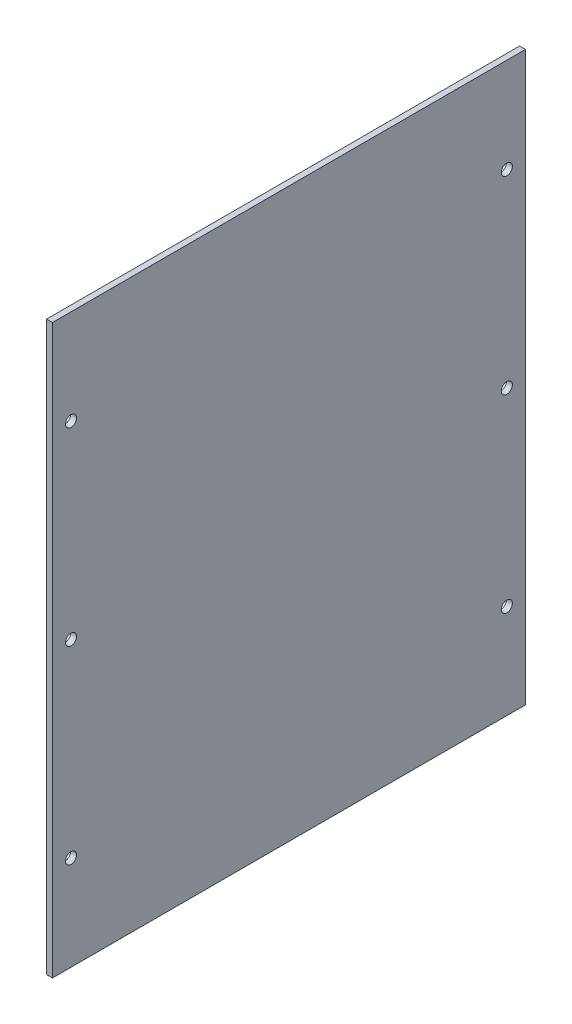
ISO-10303-21;
HEADER;
FILE_DESCRIPTION(('STEP AP214'),'2;1');
FILE_NAME('part.step','',(''),(''),'','','');
FILE_SCHEMA(('AUTOMOTIVE_DESIGN { 1 0 10303 214 1 1 1 1 }'));
ENDSEC;
DATA;
#1=APPLICATION_CONTEXT('core data for automotive mechanical design processes');
#2=APPLICATION_PROTOCOL_DEFINITION('international standard','automotive_design',2000,#1);
#3=PRODUCT_CONTEXT('',#1,'mechanical');
#4=PRODUCT('Part','Part','',(#3));
#5=PRODUCT_RELATED_PRODUCT_CATEGORY('part','',(#4));
#6=PRODUCT_DEFINITION_FORMATION('','',#4);
#7=PRODUCT_DEFINITION_CONTEXT('part definition',#1,'design');
#8=PRODUCT_DEFINITION('design','',#6,#7);
#9=PRODUCT_DEFINITION_SHAPE('','',#8);
#10=(LENGTH_UNIT() NAMED_UNIT(*) SI_UNIT(.MILLI.,.METRE.));
#11=(NAMED_UNIT(*) PLANE_ANGLE_UNIT() SI_UNIT($,.RADIAN.));
#12=(NAMED_UNIT(*) SI_UNIT($,.STERADIAN.) SOLID_ANGLE_UNIT());
#13=UNCERTAINTY_MEASURE_WITH_UNIT(LENGTH_MEASURE(1.E-05),#10,'distance_accuracy_value','');
#14=(GEOMETRIC_REPRESENTATION_CONTEXT(3) GLOBAL_UNCERTAINTY_ASSIGNED_CONTEXT((#13)) GLOBAL_UNIT_ASSIGNED_CONTEXT((#10,
#11,#12)) REPRESENTATION_CONTEXT('',''));
#15=CARTESIAN_POINT('',(0.,0.,0.));
#16=DIRECTION('',(0.,0.,1.));
#17=DIRECTION('',(1.,0.,0.));
#18=AXIS2_PLACEMENT_3D('',#15,#16,#17);
#19=CARTESIAN_POINT('',(1.5875,152.4,127.));
#20=DIRECTION('',(-1.,0.,0.));
#21=DIRECTION('',(0.,0.,1.));
#22=AXIS2_PLACEMENT_3D('',#19,#20,#21);
#23=PLANE('',#22);
#24=CARTESIAN_POINT('',(1.5875,101.6,-116.999999999999));
#25=DIRECTION('',(1.,0.,0.));
#26=DIRECTION('',(0.,0.,-1.));
#27=AXIS2_PLACEMENT_3D('',#24,#25,#26);
#28=CIRCLE('',#27,2.9718);
#29=CARTESIAN_POINT('',(1.5875,101.6,-119.971799999999));
#30=VERTEX_POINT('',#29);
#31=EDGE_CURVE('E138',#30,#30,#28,.T.);
#32=ORIENTED_EDGE('',*,*,#31,.F.);
#33=EDGE_LOOP('',(#32));
#34=FACE_BOUND('',#33,.T.);
#35=CARTESIAN_POINT('',(1.5875,-101.6,-116.999999999999));
#36=DIRECTION('',(1.,0.,0.));
#37=DIRECTION('',(0.,0.,1.));
#38=AXIS2_PLACEMENT_3D('',#35,#36,#37);
#39=CIRCLE('',#38,2.9718);
#40=CARTESIAN_POINT('',(1.5875,-101.6,-114.028199999999));
#41=VERTEX_POINT('',#40);
#42=EDGE_CURVE('E132',#41,#41,#39,.T.);
#43=ORIENTED_EDGE('',*,*,#42,.F.);
#44=EDGE_LOOP('',(#43));
#45=FACE_BOUND('',#44,.T.);
#46=CARTESIAN_POINT('',(1.5875,-8.32667268468867E-13,117.));
#47=DIRECTION('',(1.,0.,0.));
#48=DIRECTION('',(0.,0.,1.));
#49=AXIS2_PLACEMENT_3D('',#46,#47,#48);
#50=CIRCLE('',#49,2.9718);
#51=CARTESIAN_POINT('',(1.5875,-8.32667268468867E-13,119.9718));
#52=VERTEX_POINT('',#51);
#53=EDGE_CURVE('E126',#52,#52,#50,.T.);
#54=ORIENTED_EDGE('',*,*,#53,.F.);
#55=EDGE_LOOP('',(#54));
#56=FACE_BOUND('',#55,.T.);
#57=CARTESIAN_POINT('',(1.5875,-101.600000000001,116.999999999999));
#58=DIRECTION('',(1.,0.,0.));
#59=DIRECTION('',(0.,0.,-1.));
#60=AXIS2_PLACEMENT_3D('',#57,#58,#59);
#61=CIRCLE('',#60,2.9718);
#62=CARTESIAN_POINT('',(1.5875,-101.600000000001,114.028199999999));
#63=VERTEX_POINT('',#62);
#64=EDGE_CURVE('E119',#63,#63,#61,.T.);
#65=ORIENTED_EDGE('',*,*,#64,.F.);
#66=EDGE_LOOP('',(#65));
#67=FACE_BOUND('',#66,.T.);
#68=CARTESIAN_POINT('',(1.5875,101.599999999999,117.));
#69=DIRECTION('',(1.,0.,0.));
#70=DIRECTION('',(0.,0.,1.));
#71=AXIS2_PLACEMENT_3D('',#68,#69,#70);
#72=CIRCLE('',#71,2.9718);
#73=CARTESIAN_POINT('',(1.5875,101.599999999999,119.9718));
#74=VERTEX_POINT('',#73);
#75=EDGE_CURVE('E143',#74,#74,#72,.T.);
#76=ORIENTED_EDGE('',*,*,#75,.F.);
#77=EDGE_LOOP('',(#76));
#78=FACE_BOUND('',#77,.T.);
#79=CARTESIAN_POINT('',(1.5875,0.,-117.));
#80=DIRECTION('',(1.,0.,0.));
#81=DIRECTION('',(0.,0.,-1.));
#82=AXIS2_PLACEMENT_3D('',#79,#80,#81);
#83=CIRCLE('',#82,2.9718);
#84=CARTESIAN_POINT('',(1.5875,0.,-119.9718));
#85=VERTEX_POINT('',#84);
#86=EDGE_CURVE('E113',#85,#85,#83,.T.);
#87=ORIENTED_EDGE('',*,*,#86,.F.);
#88=EDGE_LOOP('',(#87));
#89=FACE_BOUND('',#88,.T.);
#90=DIRECTION('',(0.,0.,-1.));
#91=VECTOR('',#90,1.);
#92=CARTESIAN_POINT('',(1.5875,-152.4,127.));
#93=LINE('',#92,#91);
#94=CARTESIAN_POINT('',(1.5875,-152.4,127.));
#95=VERTEX_POINT('',#94);
#96=CARTESIAN_POINT('',(1.5875,-152.4,-127.));
#97=VERTEX_POINT('',#96);
#98=EDGE_CURVE('E99',#95,#97,#93,.T.);
#99=ORIENTED_EDGE('',*,*,#98,.T.);
#100=DIRECTION('',(0.,-1.,0.));
#101=VECTOR('',#100,1.);
#102=CARTESIAN_POINT('',(1.5875,152.4,-127.));
#103=LINE('',#102,#101);
#104=CARTESIAN_POINT('',(1.5875,152.4,-127.));
#105=VERTEX_POINT('',#104);
#106=EDGE_CURVE('E11',#105,#97,#103,.T.);
#107=ORIENTED_EDGE('',*,*,#106,.F.);
#108=DIRECTION('',(0.,0.,-1.));
#109=VECTOR('',#108,1.);
#110=CARTESIAN_POINT('',(1.5875,152.4,127.));
#111=LINE('',#110,#109);
#112=CARTESIAN_POINT('',(1.5875,152.4,127.));
#113=VERTEX_POINT('',#112);
#114=EDGE_CURVE('E87',#113,#105,#111,.T.);
#115=ORIENTED_EDGE('',*,*,#114,.F.);
#116=DIRECTION('',(0.,-1.,0.));
#117=VECTOR('',#116,1.);
#118=CARTESIAN_POINT('',(1.5875,152.4,127.));
#119=LINE('',#118,#117);
#120=EDGE_CURVE('E95',#113,#95,#119,.T.);
#121=ORIENTED_EDGE('',*,*,#120,.T.);
#122=EDGE_LOOP('',(#99,#107,#115,#121));
#123=FACE_BOUND('',#122,.T.);
#124=ADVANCED_FACE('F36',(#34,#45,#56,#67,#78,#89,#123),#23,.F.);
#125=CARTESIAN_POINT('',(-1.5875,152.4,-127.));
#126=DIRECTION('',(0.,0.,1.));
#127=DIRECTION('',(1.,0.,0.));
#128=AXIS2_PLACEMENT_3D('',#125,#126,#127);
#129=PLANE('',#128);
#130=DIRECTION('',(-1.,0.,0.));
#131=VECTOR('',#130,1.);
#132=CARTESIAN_POINT('',(-1.5875,-152.4,-127.));
#133=LINE('',#132,#131);
#134=CARTESIAN_POINT('',(-1.5875,-152.4,-127.));
#135=VERTEX_POINT('',#134);
#136=EDGE_CURVE('E91',#97,#135,#133,.T.);
#137=ORIENTED_EDGE('',*,*,#136,.T.);
#138=DIRECTION('',(0.,-1.,0.));
#139=VECTOR('',#138,1.);
#140=CARTESIAN_POINT('',(-1.5875,152.4,-127.));
#141=LINE('',#140,#139);
#142=CARTESIAN_POINT('',(-1.5875,152.4,-127.));
#143=VERTEX_POINT('',#142);
#144=EDGE_CURVE('E44',#143,#135,#141,.T.);
#145=ORIENTED_EDGE('',*,*,#144,.F.);
#146=DIRECTION('',(-1.,0.,0.));
#147=VECTOR('',#146,1.);
#148=CARTESIAN_POINT('',(-1.5875,152.4,-127.));
#149=LINE('',#148,#147);
#150=EDGE_CURVE('E82',#105,#143,#149,.T.);
#151=ORIENTED_EDGE('',*,*,#150,.F.);
#152=ORIENTED_EDGE('',*,*,#106,.T.);
#153=EDGE_LOOP('',(#137,#145,#151,#152));
#154=FACE_BOUND('',#153,.T.);
#155=ADVANCED_FACE('F90',(#154),#129,.F.);
#156=CARTESIAN_POINT('',(-1.5875,152.4,127.));
#157=DIRECTION('',(1.,0.,0.));
#158=DIRECTION('',(0.,0.,-1.));
#159=AXIS2_PLACEMENT_3D('',#156,#157,#158);
#160=PLANE('',#159);
#161=CARTESIAN_POINT('',(-1.5875,101.6,-116.999999999999));
#162=DIRECTION('',(1.,0.,0.));
#163=DIRECTION('',(0.,0.,-1.));
#164=AXIS2_PLACEMENT_3D('',#161,#162,#163);
#165=CIRCLE('',#164,2.9718);
#166=CARTESIAN_POINT('',(-1.5875,101.6,-119.971799999999));
#167=VERTEX_POINT('',#166);
#168=EDGE_CURVE('E116',#167,#167,#165,.T.);
#169=ORIENTED_EDGE('',*,*,#168,.T.);
#170=EDGE_LOOP('',(#169));
#171=FACE_BOUND('',#170,.T.);
#172=CARTESIAN_POINT('',(-1.5875,-101.6,-116.999999999999));
#173=DIRECTION('',(1.,0.,0.));
#174=DIRECTION('',(0.,0.,1.));
#175=AXIS2_PLACEMENT_3D('',#172,#173,#174);
#176=CIRCLE('',#175,2.9718);
#177=CARTESIAN_POINT('',(-1.5875,-101.6,-114.028199999999));
#178=VERTEX_POINT('',#177);
#179=EDGE_CURVE('E135',#178,#178,#176,.T.);
#180=ORIENTED_EDGE('',*,*,#179,.T.);
#181=EDGE_LOOP('',(#180));
#182=FACE_BOUND('',#181,.T.);
#183=CARTESIAN_POINT('',(-1.5875,-8.32667268468867E-13,117.));
#184=DIRECTION('',(1.,0.,0.));
#185=DIRECTION('',(0.,0.,1.));
#186=AXIS2_PLACEMENT_3D('',#183,#184,#185);
#187=CIRCLE('',#186,2.9718);
#188=CARTESIAN_POINT('',(-1.5875,-8.32667268468867E-13,119.9718));
#189=VERTEX_POINT('',#188);
#190=EDGE_CURVE('E129',#189,#189,#187,.T.);
#191=ORIENTED_EDGE('',*,*,#190,.T.);
#192=EDGE_LOOP('',(#191));
#193=FACE_BOUND('',#192,.T.);
#194=CARTESIAN_POINT('',(-1.5875,-101.600000000001,116.999999999999));
#195=DIRECTION('',(1.,0.,0.));
#196=DIRECTION('',(0.,0.,-1.));
#197=AXIS2_PLACEMENT_3D('',#194,#195,#196);
#198=CIRCLE('',#197,2.9718);
#199=CARTESIAN_POINT('',(-1.5875,-101.600000000001,114.028199999999));
#200=VERTEX_POINT('',#199);
#201=EDGE_CURVE('E122',#200,#200,#198,.T.);
#202=ORIENTED_EDGE('',*,*,#201,.T.);
#203=EDGE_LOOP('',(#202));
#204=FACE_BOUND('',#203,.T.);
#205=CARTESIAN_POINT('',(-1.5875,101.599999999999,117.));
#206=DIRECTION('',(1.,0.,0.));
#207=DIRECTION('',(0.,0.,1.));
#208=AXIS2_PLACEMENT_3D('',#205,#206,#207);
#209=CIRCLE('',#208,2.9718);
#210=CARTESIAN_POINT('',(-1.5875,101.599999999999,119.9718));
#211=VERTEX_POINT('',#210);
#212=EDGE_CURVE('E123',#211,#211,#209,.T.);
#213=ORIENTED_EDGE('',*,*,#212,.T.);
#214=EDGE_LOOP('',(#213));
#215=FACE_BOUND('',#214,.T.);
#216=CARTESIAN_POINT('',(-1.5875,0.,-117.));
#217=DIRECTION('',(1.,0.,0.));
#218=DIRECTION('',(0.,0.,-1.));
#219=AXIS2_PLACEMENT_3D('',#216,#217,#218);
#220=CIRCLE('',#219,2.9718);
#221=CARTESIAN_POINT('',(-1.5875,0.,-119.9718));
#222=VERTEX_POINT('',#221);
#223=EDGE_CURVE('E102',#222,#222,#220,.T.);
#224=ORIENTED_EDGE('',*,*,#223,.T.);
#225=EDGE_LOOP('',(#224));
#226=FACE_BOUND('',#225,.T.);
#227=DIRECTION('',(0.,0.,1.));
#228=VECTOR('',#227,1.);
#229=CARTESIAN_POINT('',(-1.5875,-152.4,127.));
#230=LINE('',#229,#228);
#231=CARTESIAN_POINT('',(-1.5875,-152.4,127.));
#232=VERTEX_POINT('',#231);
#233=EDGE_CURVE('E69',#135,#232,#230,.T.);
#234=ORIENTED_EDGE('',*,*,#233,.T.);
#235=DIRECTION('',(0.,-1.,0.));
#236=VECTOR('',#235,1.);
#237=CARTESIAN_POINT('',(-1.5875,152.4,127.));
#238=LINE('',#237,#236);
#239=CARTESIAN_POINT('',(-1.5875,152.4,127.));
#240=VERTEX_POINT('',#239);
#241=EDGE_CURVE('E92',#240,#232,#238,.T.);
#242=ORIENTED_EDGE('',*,*,#241,.F.);
#243=DIRECTION('',(0.,0.,1.));
#244=VECTOR('',#243,1.);
#245=CARTESIAN_POINT('',(-1.5875,152.4,127.));
#246=LINE('',#245,#244);
#247=EDGE_CURVE('E85',#143,#240,#246,.T.);
#248=ORIENTED_EDGE('',*,*,#247,.F.);
#249=ORIENTED_EDGE('',*,*,#144,.T.);
#250=EDGE_LOOP('',(#234,#242,#248,#249));
#251=FACE_BOUND('',#250,.T.);
#252=ADVANCED_FACE('F93',(#171,#182,#193,#204,#215,#226,#251),#160,.F.);
#253=CARTESIAN_POINT('',(-1.5875,152.4,127.));
#254=DIRECTION('',(0.,0.,-1.));
#255=DIRECTION('',(-1.,0.,0.));
#256=AXIS2_PLACEMENT_3D('',#253,#254,#255);
#257=PLANE('',#256);
#258=DIRECTION('',(1.,0.,0.));
#259=VECTOR('',#258,1.);
#260=CARTESIAN_POINT('',(-1.5875,-152.4,127.));
#261=LINE('',#260,#259);
#262=EDGE_CURVE('E75',#232,#95,#261,.T.);
#263=ORIENTED_EDGE('',*,*,#262,.T.);
#264=ORIENTED_EDGE('',*,*,#120,.F.);
#265=DIRECTION('',(1.,0.,0.));
#266=VECTOR('',#265,1.);
#267=CARTESIAN_POINT('',(-1.5875,152.4,127.));
#268=LINE('',#267,#266);
#269=EDGE_CURVE('E52',#240,#113,#268,.T.);
#270=ORIENTED_EDGE('',*,*,#269,.F.);
#271=ORIENTED_EDGE('',*,*,#241,.T.);
#272=EDGE_LOOP('',(#263,#264,#270,#271));
#273=FACE_BOUND('',#272,.T.);
#274=ADVANCED_FACE('F107',(#273),#257,.F.);
#275=CARTESIAN_POINT('',(0.,152.4,0.));
#276=DIRECTION('',(0.,-1.,0.));
#277=DIRECTION('',(0.,0.,-1.));
#278=AXIS2_PLACEMENT_3D('',#275,#276,#277);
#279=PLANE('',#278);
#280=ORIENTED_EDGE('',*,*,#114,.T.);
#281=ORIENTED_EDGE('',*,*,#150,.T.);
#282=ORIENTED_EDGE('',*,*,#247,.T.);
#283=ORIENTED_EDGE('',*,*,#269,.T.);
#284=EDGE_LOOP('',(#280,#281,#282,#283));
#285=FACE_BOUND('',#284,.T.);
#286=ADVANCED_FACE('F83',(#285),#279,.F.);
#287=CARTESIAN_POINT('',(0.,-152.4,0.));
#288=DIRECTION('',(0.,-1.,0.));
#289=DIRECTION('',(0.,0.,-1.));
#290=AXIS2_PLACEMENT_3D('',#287,#288,#289);
#291=PLANE('',#290);
#292=ORIENTED_EDGE('',*,*,#98,.F.);
#293=ORIENTED_EDGE('',*,*,#262,.F.);
#294=ORIENTED_EDGE('',*,*,#233,.F.);
#295=ORIENTED_EDGE('',*,*,#136,.F.);
#296=EDGE_LOOP('',(#292,#293,#294,#295));
#297=FACE_BOUND('',#296,.T.);
#298=ADVANCED_FACE('F110',(#297),#291,.T.);
#299=CARTESIAN_POINT('',(-1.5875,0.,-117.));
#300=DIRECTION('',(1.,0.,0.));
#301=DIRECTION('',(0.,0.,-1.));
#302=AXIS2_PLACEMENT_3D('',#299,#300,#301);
#303=CYLINDRICAL_SURFACE('',#302,2.9718);
#304=ORIENTED_EDGE('',*,*,#223,.F.);
#305=EDGE_LOOP('',(#304));
#306=FACE_BOUND('',#305,.T.);
#307=ORIENTED_EDGE('',*,*,#86,.T.);
#308=EDGE_LOOP('',(#307));
#309=FACE_BOUND('',#308,.T.);
#310=ADVANCED_FACE('F155',(#306,#309),#303,.F.);
#311=CARTESIAN_POINT('',(-1.5875,101.599999999999,117.));
#312=DIRECTION('',(1.,0.,0.));
#313=DIRECTION('',(0.,0.,-1.));
#314=AXIS2_PLACEMENT_3D('',#311,#312,#313);
#315=CYLINDRICAL_SURFACE('',#314,2.9718);
#316=ORIENTED_EDGE('',*,*,#212,.F.);
#317=EDGE_LOOP('',(#316));
#318=FACE_BOUND('',#317,.T.);
#319=ORIENTED_EDGE('',*,*,#75,.T.);
#320=EDGE_LOOP('',(#319));
#321=FACE_BOUND('',#320,.T.);
#322=ADVANCED_FACE('F151',(#318,#321),#315,.F.);
#323=CARTESIAN_POINT('',(-1.5875,-101.600000000001,116.999999999999));
#324=DIRECTION('',(1.,0.,0.));
#325=DIRECTION('',(0.,0.,-1.));
#326=AXIS2_PLACEMENT_3D('',#323,#324,#325);
#327=CYLINDRICAL_SURFACE('',#326,2.9718);
#328=ORIENTED_EDGE('',*,*,#201,.F.);
#329=EDGE_LOOP('',(#328));
#330=FACE_BOUND('',#329,.T.);
#331=ORIENTED_EDGE('',*,*,#64,.T.);
#332=EDGE_LOOP('',(#331));
#333=FACE_BOUND('',#332,.T.);
#334=ADVANCED_FACE('F154',(#330,#333),#327,.F.);
#335=CARTESIAN_POINT('',(-1.5875,-8.32667268468867E-13,117.));
#336=DIRECTION('',(1.,0.,0.));
#337=DIRECTION('',(0.,0.,-1.));
#338=AXIS2_PLACEMENT_3D('',#335,#336,#337);
#339=CYLINDRICAL_SURFACE('',#338,2.9718);
#340=ORIENTED_EDGE('',*,*,#190,.F.);
#341=EDGE_LOOP('',(#340));
#342=FACE_BOUND('',#341,.T.);
#343=ORIENTED_EDGE('',*,*,#53,.T.);
#344=EDGE_LOOP('',(#343));
#345=FACE_BOUND('',#344,.T.);
#346=ADVANCED_FACE('F233',(#342,#345),#339,.F.);
#347=CARTESIAN_POINT('',(-1.5875,-101.6,-116.999999999999));
#348=DIRECTION('',(1.,0.,0.));
#349=DIRECTION('',(0.,0.,-1.));
#350=AXIS2_PLACEMENT_3D('',#347,#348,#349);
#351=CYLINDRICAL_SURFACE('',#350,2.9718);
#352=ORIENTED_EDGE('',*,*,#179,.F.);
#353=EDGE_LOOP('',(#352));
#354=FACE_BOUND('',#353,.T.);
#355=ORIENTED_EDGE('',*,*,#42,.T.);
#356=EDGE_LOOP('',(#355));
#357=FACE_BOUND('',#356,.T.);
#358=ADVANCED_FACE('F241',(#354,#357),#351,.F.);
#359=CARTESIAN_POINT('',(-1.5875,101.6,-116.999999999999));
#360=DIRECTION('',(1.,0.,0.));
#361=DIRECTION('',(0.,0.,-1.));
#362=AXIS2_PLACEMENT_3D('',#359,#360,#361);
#363=CYLINDRICAL_SURFACE('',#362,2.9718);
#364=ORIENTED_EDGE('',*,*,#168,.F.);
#365=EDGE_LOOP('',(#364));
#366=FACE_BOUND('',#365,.T.);
#367=ORIENTED_EDGE('',*,*,#31,.T.);
#368=EDGE_LOOP('',(#367));
#369=FACE_BOUND('',#368,.T.);
#370=ADVANCED_FACE('F249',(#366,#369),#363,.F.);
#371=CLOSED_SHELL('',(#124,#155,#252,#274,#286,#298,#310,#322,#334,#346,#358,#370));
#372=MANIFOLD_SOLID_BREP('B2',#371);
#373=ADVANCED_BREP_SHAPE_REPRESENTATION('',(#18,#372),#14);
#374=SHAPE_DEFINITION_REPRESENTATION(#9,#373);
ENDSEC;
END-ISO-10303-21;
